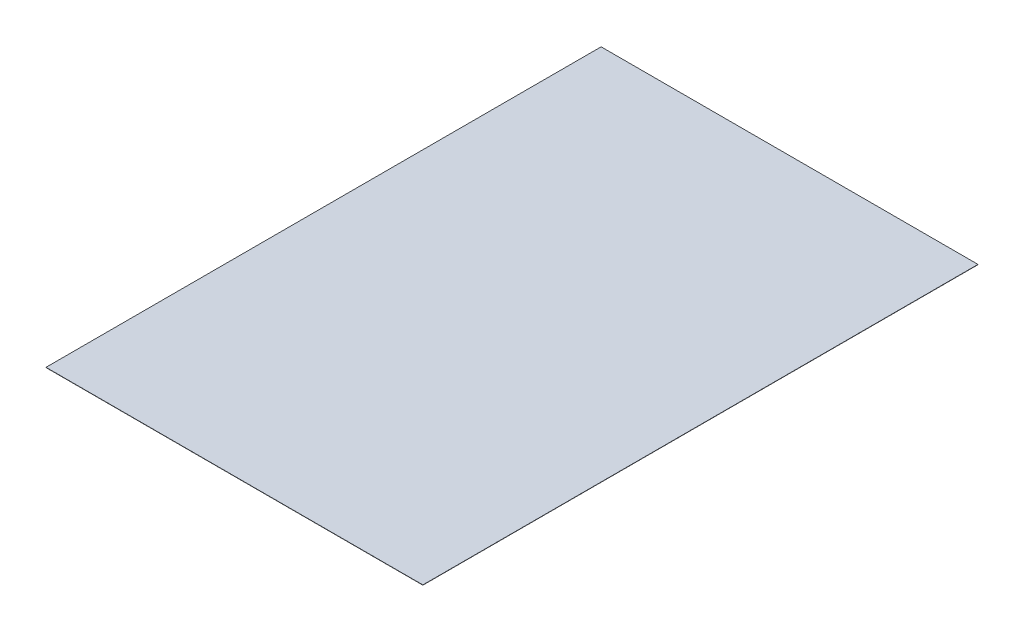
ISO-10303-21;
HEADER;
FILE_DESCRIPTION(('STEP AP214'),'2;1');
FILE_NAME('part.step','',(''),(''),'','','');
FILE_SCHEMA(('AUTOMOTIVE_DESIGN { 1 0 10303 214 1 1 1 1 }'));
ENDSEC;
DATA;
#1=APPLICATION_CONTEXT('core data for automotive mechanical design processes');
#2=APPLICATION_PROTOCOL_DEFINITION('international standard','automotive_design',2000,#1);
#3=PRODUCT_CONTEXT('',#1,'mechanical');
#4=PRODUCT('Part','Part','',(#3));
#5=PRODUCT_RELATED_PRODUCT_CATEGORY('part','',(#4));
#6=PRODUCT_DEFINITION_FORMATION('','',#4);
#7=PRODUCT_DEFINITION_CONTEXT('part definition',#1,'design');
#8=PRODUCT_DEFINITION('design','',#6,#7);
#9=PRODUCT_DEFINITION_SHAPE('','',#8);
#10=(LENGTH_UNIT() NAMED_UNIT(*) SI_UNIT(.MILLI.,.METRE.));
#11=(NAMED_UNIT(*) PLANE_ANGLE_UNIT() SI_UNIT($,.RADIAN.));
#12=(NAMED_UNIT(*) SI_UNIT($,.STERADIAN.) SOLID_ANGLE_UNIT());
#13=UNCERTAINTY_MEASURE_WITH_UNIT(LENGTH_MEASURE(1.E-05),#10,'distance_accuracy_value','');
#14=(GEOMETRIC_REPRESENTATION_CONTEXT(3) GLOBAL_UNCERTAINTY_ASSIGNED_CONTEXT((#13)) GLOBAL_UNIT_ASSIGNED_CONTEXT((#10,
#11,#12)) REPRESENTATION_CONTEXT('',''));
#15=CARTESIAN_POINT('',(0.,0.,0.));
#16=DIRECTION('',(0.,0.,1.));
#17=DIRECTION('',(1.,0.,0.));
#18=AXIS2_PLACEMENT_3D('',#15,#16,#17);
#19=CARTESIAN_POINT('',(-3700.,5.,5450.));
#20=DIRECTION('',(1.,0.,0.));
#21=DIRECTION('',(0.,0.,-1.));
#22=AXIS2_PLACEMENT_3D('',#19,#20,#21);
#23=PLANE('',#22);
#24=DIRECTION('',(0.,0.,1.));
#25=VECTOR('',#24,1.);
#26=CARTESIAN_POINT('',(-3700.,0.,5450.));
#27=LINE('',#26,#25);
#28=CARTESIAN_POINT('',(-3700.,0.,-5450.));
#29=VERTEX_POINT('',#28);
#30=CARTESIAN_POINT('',(-3700.,0.,5450.));
#31=VERTEX_POINT('',#30);
#32=EDGE_CURVE('E96',#29,#31,#27,.T.);
#33=ORIENTED_EDGE('',*,*,#32,.T.);
#34=DIRECTION('',(0.,-1.,0.));
#35=VECTOR('',#34,1.);
#36=CARTESIAN_POINT('',(-3700.,5.,5450.));
#37=LINE('',#36,#35);
#38=CARTESIAN_POINT('',(-3700.,5.,5450.));
#39=VERTEX_POINT('',#38);
#40=EDGE_CURVE('E11',#39,#31,#37,.T.);
#41=ORIENTED_EDGE('',*,*,#40,.F.);
#42=DIRECTION('',(0.,0.,1.));
#43=VECTOR('',#42,1.);
#44=CARTESIAN_POINT('',(-3700.,5.,5450.));
#45=LINE('',#44,#43);
#46=CARTESIAN_POINT('',(-3700.,5.,-5450.));
#47=VERTEX_POINT('',#46);
#48=EDGE_CURVE('E84',#47,#39,#45,.T.);
#49=ORIENTED_EDGE('',*,*,#48,.F.);
#50=DIRECTION('',(0.,-1.,0.));
#51=VECTOR('',#50,1.);
#52=CARTESIAN_POINT('',(-3700.,5.,-5450.));
#53=LINE('',#52,#51);
#54=EDGE_CURVE('E92',#47,#29,#53,.T.);
#55=ORIENTED_EDGE('',*,*,#54,.T.);
#56=EDGE_LOOP('',(#33,#41,#49,#55));
#57=FACE_BOUND('',#56,.T.);
#58=ADVANCED_FACE('F33',(#57),#23,.F.);
#59=CARTESIAN_POINT('',(3700.,5.,5450.));
#60=DIRECTION('',(0.,0.,-1.));
#61=DIRECTION('',(-1.,0.,0.));
#62=AXIS2_PLACEMENT_3D('',#59,#60,#61);
#63=PLANE('',#62);
#64=DIRECTION('',(1.,0.,0.));
#65=VECTOR('',#64,1.);
#66=CARTESIAN_POINT('',(3700.,0.,5450.));
#67=LINE('',#66,#65);
#68=CARTESIAN_POINT('',(3700.,0.,5450.));
#69=VERTEX_POINT('',#68);
#70=EDGE_CURVE('E88',#31,#69,#67,.T.);
#71=ORIENTED_EDGE('',*,*,#70,.T.);
#72=DIRECTION('',(0.,-1.,0.));
#73=VECTOR('',#72,1.);
#74=CARTESIAN_POINT('',(3700.,5.,5450.));
#75=LINE('',#74,#73);
#76=CARTESIAN_POINT('',(3700.,5.,5450.));
#77=VERTEX_POINT('',#76);
#78=EDGE_CURVE('E41',#77,#69,#75,.T.);
#79=ORIENTED_EDGE('',*,*,#78,.F.);
#80=DIRECTION('',(1.,0.,0.));
#81=VECTOR('',#80,1.);
#82=CARTESIAN_POINT('',(3700.,5.,5450.));
#83=LINE('',#82,#81);
#84=EDGE_CURVE('E79',#39,#77,#83,.T.);
#85=ORIENTED_EDGE('',*,*,#84,.F.);
#86=ORIENTED_EDGE('',*,*,#40,.T.);
#87=EDGE_LOOP('',(#71,#79,#85,#86));
#88=FACE_BOUND('',#87,.T.);
#89=ADVANCED_FACE('F87',(#88),#63,.F.);
#90=CARTESIAN_POINT('',(3700.,5.,5450.));
#91=DIRECTION('',(-1.,0.,0.));
#92=DIRECTION('',(0.,0.,1.));
#93=AXIS2_PLACEMENT_3D('',#90,#91,#92);
#94=PLANE('',#93);
#95=DIRECTION('',(0.,0.,-1.));
#96=VECTOR('',#95,1.);
#97=CARTESIAN_POINT('',(3700.,0.,5450.));
#98=LINE('',#97,#96);
#99=CARTESIAN_POINT('',(3700.,0.,-5450.));
#100=VERTEX_POINT('',#99);
#101=EDGE_CURVE('E66',#69,#100,#98,.T.);
#102=ORIENTED_EDGE('',*,*,#101,.T.);
#103=DIRECTION('',(0.,-1.,0.));
#104=VECTOR('',#103,1.);
#105=CARTESIAN_POINT('',(3700.,5.,-5450.));
#106=LINE('',#105,#104);
#107=CARTESIAN_POINT('',(3700.,5.,-5450.));
#108=VERTEX_POINT('',#107);
#109=EDGE_CURVE('E89',#108,#100,#106,.T.);
#110=ORIENTED_EDGE('',*,*,#109,.F.);
#111=DIRECTION('',(0.,0.,-1.));
#112=VECTOR('',#111,1.);
#113=CARTESIAN_POINT('',(3700.,5.,5450.));
#114=LINE('',#113,#112);
#115=EDGE_CURVE('E82',#77,#108,#114,.T.);
#116=ORIENTED_EDGE('',*,*,#115,.F.);
#117=ORIENTED_EDGE('',*,*,#78,.T.);
#118=EDGE_LOOP('',(#102,#110,#116,#117));
#119=FACE_BOUND('',#118,.T.);
#120=ADVANCED_FACE('F90',(#119),#94,.F.);
#121=CARTESIAN_POINT('',(3700.,5.,-5450.));
#122=DIRECTION('',(0.,0.,1.));
#123=DIRECTION('',(1.,0.,0.));
#124=AXIS2_PLACEMENT_3D('',#121,#122,#123);
#125=PLANE('',#124);
#126=DIRECTION('',(-1.,0.,0.));
#127=VECTOR('',#126,1.);
#128=CARTESIAN_POINT('',(3700.,0.,-5450.));
#129=LINE('',#128,#127);
#130=EDGE_CURVE('E72',#100,#29,#129,.T.);
#131=ORIENTED_EDGE('',*,*,#130,.T.);
#132=ORIENTED_EDGE('',*,*,#54,.F.);
#133=DIRECTION('',(-1.,0.,0.));
#134=VECTOR('',#133,1.);
#135=CARTESIAN_POINT('',(3700.,5.,-5450.));
#136=LINE('',#135,#134);
#137=EDGE_CURVE('E49',#108,#47,#136,.T.);
#138=ORIENTED_EDGE('',*,*,#137,.F.);
#139=ORIENTED_EDGE('',*,*,#109,.T.);
#140=EDGE_LOOP('',(#131,#132,#138,#139));
#141=FACE_BOUND('',#140,.T.);
#142=ADVANCED_FACE('F103',(#141),#125,.F.);
#143=CARTESIAN_POINT('',(0.,5.,0.));
#144=DIRECTION('',(0.,1.,0.));
#145=DIRECTION('',(0.,0.,1.));
#146=AXIS2_PLACEMENT_3D('',#143,#144,#145);
#147=PLANE('',#146);
#148=ORIENTED_EDGE('',*,*,#48,.T.);
#149=ORIENTED_EDGE('',*,*,#84,.T.);
#150=ORIENTED_EDGE('',*,*,#115,.T.);
#151=ORIENTED_EDGE('',*,*,#137,.T.);
#152=EDGE_LOOP('',(#148,#149,#150,#151));
#153=FACE_BOUND('',#152,.T.);
#154=ADVANCED_FACE('F80',(#153),#147,.T.);
#155=CARTESIAN_POINT('',(0.,0.,0.));
#156=DIRECTION('',(0.,1.,0.));
#157=DIRECTION('',(0.,0.,1.));
#158=AXIS2_PLACEMENT_3D('',#155,#156,#157);
#159=PLANE('',#158);
#160=ORIENTED_EDGE('',*,*,#32,.F.);
#161=ORIENTED_EDGE('',*,*,#130,.F.);
#162=ORIENTED_EDGE('',*,*,#101,.F.);
#163=ORIENTED_EDGE('',*,*,#70,.F.);
#164=EDGE_LOOP('',(#160,#161,#162,#163));
#165=FACE_BOUND('',#164,.T.);
#166=ADVANCED_FACE('F106',(#165),#159,.F.);
#167=CLOSED_SHELL('',(#58,#89,#120,#142,#154,#166));
#168=MANIFOLD_SOLID_BREP('B2',#167);
#169=ADVANCED_BREP_SHAPE_REPRESENTATION('',(#18,#168),#14);
#170=SHAPE_DEFINITION_REPRESENTATION(#9,#169);
ENDSEC;
END-ISO-10303-21;
